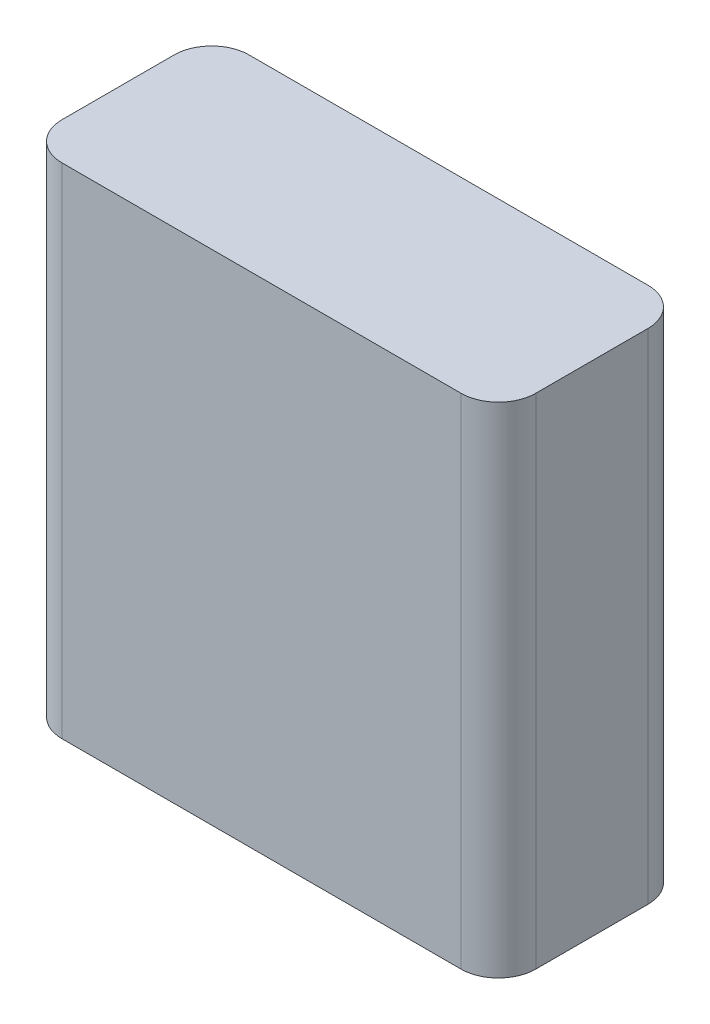
ISO-10303-21;
HEADER;
FILE_DESCRIPTION(('STEP AP214'),'2;1');
FILE_NAME('part.step','',(''),(''),'','','');
FILE_SCHEMA(('AUTOMOTIVE_DESIGN { 1 0 10303 214 1 1 1 1 }'));
ENDSEC;
DATA;
#1=APPLICATION_CONTEXT('core data for automotive mechanical design processes');
#2=APPLICATION_PROTOCOL_DEFINITION('international standard','automotive_design',2000,#1);
#3=PRODUCT_CONTEXT('',#1,'mechanical');
#4=PRODUCT('Part','Part','',(#3));
#5=PRODUCT_RELATED_PRODUCT_CATEGORY('part','',(#4));
#6=PRODUCT_DEFINITION_FORMATION('','',#4);
#7=PRODUCT_DEFINITION_CONTEXT('part definition',#1,'design');
#8=PRODUCT_DEFINITION('design','',#6,#7);
#9=PRODUCT_DEFINITION_SHAPE('','',#8);
#10=(LENGTH_UNIT() NAMED_UNIT(*) SI_UNIT(.MILLI.,.METRE.));
#11=(NAMED_UNIT(*) PLANE_ANGLE_UNIT() SI_UNIT($,.RADIAN.));
#12=(NAMED_UNIT(*) SI_UNIT($,.STERADIAN.) SOLID_ANGLE_UNIT());
#13=UNCERTAINTY_MEASURE_WITH_UNIT(LENGTH_MEASURE(1.E-05),#10,'distance_accuracy_value','');
#14=(GEOMETRIC_REPRESENTATION_CONTEXT(3) GLOBAL_UNCERTAINTY_ASSIGNED_CONTEXT((#13)) GLOBAL_UNIT_ASSIGNED_CONTEXT((#10,
#11,#12)) REPRESENTATION_CONTEXT('',''));
#15=CARTESIAN_POINT('',(0.,0.,0.));
#16=DIRECTION('',(0.,0.,1.));
#17=DIRECTION('',(1.,0.,0.));
#18=AXIS2_PLACEMENT_3D('',#15,#16,#17);
#19=CARTESIAN_POINT('',(406.4,1016.,-114.3));
#20=DIRECTION('',(0.,-1.,0.));
#21=DIRECTION('',(0.,0.,-1.));
#22=AXIS2_PLACEMENT_3D('',#19,#20,#21);
#23=CYLINDRICAL_SURFACE('',#22,76.2);
#24=CARTESIAN_POINT('',(406.4,0.,-114.3));
#25=DIRECTION('',(0.,1.,0.));
#26=DIRECTION('',(0.,0.,-1.));
#27=AXIS2_PLACEMENT_3D('',#24,#25,#26);
#28=CIRCLE('',#27,76.2);
#29=CARTESIAN_POINT('',(482.6,0.,-114.3));
#30=VERTEX_POINT('',#29);
#31=CARTESIAN_POINT('',(406.4,0.,-190.5));
#32=VERTEX_POINT('',#31);
#33=EDGE_CURVE('E128',#30,#32,#28,.T.);
#34=ORIENTED_EDGE('',*,*,#33,.T.);
#35=DIRECTION('',(0.,-1.,0.));
#36=VECTOR('',#35,1.);
#37=CARTESIAN_POINT('',(406.4,1016.,-190.5));
#38=LINE('',#37,#36);
#39=CARTESIAN_POINT('',(406.4,1016.,-190.5));
#40=VERTEX_POINT('',#39);
#41=EDGE_CURVE('E11',#40,#32,#38,.T.);
#42=ORIENTED_EDGE('',*,*,#41,.F.);
#43=CARTESIAN_POINT('',(406.4,1016.,-114.3));
#44=DIRECTION('',(0.,1.,0.));
#45=DIRECTION('',(0.,0.,-1.));
#46=AXIS2_PLACEMENT_3D('',#43,#44,#45);
#47=CIRCLE('',#46,76.2);
#48=CARTESIAN_POINT('',(482.6,1016.,-114.3));
#49=VERTEX_POINT('',#48);
#50=EDGE_CURVE('E142',#49,#40,#47,.T.);
#51=ORIENTED_EDGE('',*,*,#50,.F.);
#52=DIRECTION('',(0.,-1.,0.));
#53=VECTOR('',#52,1.);
#54=CARTESIAN_POINT('',(482.6,1016.,-114.3));
#55=LINE('',#54,#53);
#56=EDGE_CURVE('E124',#49,#30,#55,.T.);
#57=ORIENTED_EDGE('',*,*,#56,.T.);
#58=EDGE_LOOP('',(#34,#42,#51,#57));
#59=FACE_BOUND('',#58,.T.);
#60=ADVANCED_FACE('F32',(#59),#23,.T.);
#61=CARTESIAN_POINT('',(-406.4,1016.,-190.5));
#62=DIRECTION('',(0.,0.,1.));
#63=DIRECTION('',(1.,0.,0.));
#64=AXIS2_PLACEMENT_3D('',#61,#62,#63);
#65=PLANE('',#64);
#66=DIRECTION('',(-1.,0.,0.));
#67=VECTOR('',#66,1.);
#68=CARTESIAN_POINT('',(-406.4,0.,-190.5));
#69=LINE('',#68,#67);
#70=CARTESIAN_POINT('',(-406.4,0.,-190.5));
#71=VERTEX_POINT('',#70);
#72=EDGE_CURVE('E131',#32,#71,#69,.T.);
#73=ORIENTED_EDGE('',*,*,#72,.T.);
#74=DIRECTION('',(0.,-1.,0.));
#75=VECTOR('',#74,1.);
#76=CARTESIAN_POINT('',(-406.4,1016.,-190.5));
#77=LINE('',#76,#75);
#78=CARTESIAN_POINT('',(-406.4,1016.,-190.5));
#79=VERTEX_POINT('',#78);
#80=EDGE_CURVE('E40',#79,#71,#77,.T.);
#81=ORIENTED_EDGE('',*,*,#80,.F.);
#82=DIRECTION('',(-1.,0.,0.));
#83=VECTOR('',#82,1.);
#84=CARTESIAN_POINT('',(-406.4,1016.,-190.5));
#85=LINE('',#84,#83);
#86=EDGE_CURVE('E91',#40,#79,#85,.T.);
#87=ORIENTED_EDGE('',*,*,#86,.F.);
#88=ORIENTED_EDGE('',*,*,#41,.T.);
#89=EDGE_LOOP('',(#73,#81,#87,#88));
#90=FACE_BOUND('',#89,.T.);
#91=ADVANCED_FACE('F177',(#90),#65,.F.);
#92=CARTESIAN_POINT('',(-406.4,1016.,-114.3));
#93=DIRECTION('',(0.,-1.,0.));
#94=DIRECTION('',(0.,0.,-1.));
#95=AXIS2_PLACEMENT_3D('',#92,#93,#94);
#96=CYLINDRICAL_SURFACE('',#95,76.2);
#97=CARTESIAN_POINT('',(-406.4,0.,-114.3));
#98=DIRECTION('',(0.,1.,0.));
#99=DIRECTION('',(0.,0.,1.));
#100=AXIS2_PLACEMENT_3D('',#97,#98,#99);
#101=CIRCLE('',#100,76.2);
#102=CARTESIAN_POINT('',(-482.6,0.,-114.3));
#103=VERTEX_POINT('',#102);
#104=EDGE_CURVE('E133',#71,#103,#101,.T.);
#105=ORIENTED_EDGE('',*,*,#104,.T.);
#106=DIRECTION('',(0.,-1.,0.));
#107=VECTOR('',#106,1.);
#108=CARTESIAN_POINT('',(-482.6,1016.,-114.3));
#109=LINE('',#108,#107);
#110=CARTESIAN_POINT('',(-482.6,1016.,-114.3));
#111=VERTEX_POINT('',#110);
#112=EDGE_CURVE('E149',#111,#103,#109,.T.);
#113=ORIENTED_EDGE('',*,*,#112,.F.);
#114=CARTESIAN_POINT('',(-406.4,1016.,-114.3));
#115=DIRECTION('',(0.,1.,0.));
#116=DIRECTION('',(0.,0.,1.));
#117=AXIS2_PLACEMENT_3D('',#114,#115,#116);
#118=CIRCLE('',#117,76.2);
#119=EDGE_CURVE('E157',#79,#111,#118,.T.);
#120=ORIENTED_EDGE('',*,*,#119,.F.);
#121=ORIENTED_EDGE('',*,*,#80,.T.);
#122=EDGE_LOOP('',(#105,#113,#120,#121));
#123=FACE_BOUND('',#122,.T.);
#124=ADVANCED_FACE('F155',(#123),#96,.T.);
#125=CARTESIAN_POINT('',(-482.6,1016.,114.3));
#126=DIRECTION('',(1.,0.,0.));
#127=DIRECTION('',(0.,0.,-1.));
#128=AXIS2_PLACEMENT_3D('',#125,#126,#127);
#129=PLANE('',#128);
#130=DIRECTION('',(0.,0.,1.));
#131=VECTOR('',#130,1.);
#132=CARTESIAN_POINT('',(-482.6,0.,114.3));
#133=LINE('',#132,#131);
#134=CARTESIAN_POINT('',(-482.6,0.,114.3));
#135=VERTEX_POINT('',#134);
#136=EDGE_CURVE('E135',#103,#135,#133,.T.);
#137=ORIENTED_EDGE('',*,*,#136,.T.);
#138=DIRECTION('',(0.,-1.,0.));
#139=VECTOR('',#138,1.);
#140=CARTESIAN_POINT('',(-482.6,1016.,114.3));
#141=LINE('',#140,#139);
#142=CARTESIAN_POINT('',(-482.6,1016.,114.3));
#143=VERTEX_POINT('',#142);
#144=EDGE_CURVE('E146',#143,#135,#141,.T.);
#145=ORIENTED_EDGE('',*,*,#144,.F.);
#146=DIRECTION('',(0.,0.,1.));
#147=VECTOR('',#146,1.);
#148=CARTESIAN_POINT('',(-482.6,1016.,114.3));
#149=LINE('',#148,#147);
#150=EDGE_CURVE('E169',#111,#143,#149,.T.);
#151=ORIENTED_EDGE('',*,*,#150,.F.);
#152=ORIENTED_EDGE('',*,*,#112,.T.);
#153=EDGE_LOOP('',(#137,#145,#151,#152));
#154=FACE_BOUND('',#153,.T.);
#155=ADVANCED_FACE('F165',(#154),#129,.F.);
#156=CARTESIAN_POINT('',(-406.4,1016.,114.3));
#157=DIRECTION('',(0.,-1.,0.));
#158=DIRECTION('',(0.,0.,-1.));
#159=AXIS2_PLACEMENT_3D('',#156,#157,#158);
#160=CYLINDRICAL_SURFACE('',#159,76.2);
#161=CARTESIAN_POINT('',(-406.4,0.,114.3));
#162=DIRECTION('',(0.,1.,0.));
#163=DIRECTION('',(0.,0.,-1.));
#164=AXIS2_PLACEMENT_3D('',#161,#162,#163);
#165=CIRCLE('',#164,76.2);
#166=CARTESIAN_POINT('',(-406.4,0.,190.5));
#167=VERTEX_POINT('',#166);
#168=EDGE_CURVE('E137',#135,#167,#165,.T.);
#169=ORIENTED_EDGE('',*,*,#168,.T.);
#170=DIRECTION('',(0.,-1.,0.));
#171=VECTOR('',#170,1.);
#172=CARTESIAN_POINT('',(-406.4,1016.,190.5));
#173=LINE('',#172,#171);
#174=CARTESIAN_POINT('',(-406.4,1016.,190.5));
#175=VERTEX_POINT('',#174);
#176=EDGE_CURVE('E119',#175,#167,#173,.T.);
#177=ORIENTED_EDGE('',*,*,#176,.F.);
#178=CARTESIAN_POINT('',(-406.4,1016.,114.3));
#179=DIRECTION('',(0.,1.,0.));
#180=DIRECTION('',(0.,0.,-1.));
#181=AXIS2_PLACEMENT_3D('',#178,#179,#180);
#182=CIRCLE('',#181,76.2);
#183=EDGE_CURVE('E110',#143,#175,#182,.T.);
#184=ORIENTED_EDGE('',*,*,#183,.F.);
#185=ORIENTED_EDGE('',*,*,#144,.T.);
#186=EDGE_LOOP('',(#169,#177,#184,#185));
#187=FACE_BOUND('',#186,.T.);
#188=ADVANCED_FACE('F168',(#187),#160,.T.);
#189=CARTESIAN_POINT('',(-406.4,1016.,190.5));
#190=DIRECTION('',(0.,0.,-1.));
#191=DIRECTION('',(-1.,0.,0.));
#192=AXIS2_PLACEMENT_3D('',#189,#190,#191);
#193=PLANE('',#192);
#194=DIRECTION('',(1.,0.,0.));
#195=VECTOR('',#194,1.);
#196=CARTESIAN_POINT('',(-406.4,0.,190.5));
#197=LINE('',#196,#195);
#198=CARTESIAN_POINT('',(406.4,0.,190.5));
#199=VERTEX_POINT('',#198);
#200=EDGE_CURVE('E118',#167,#199,#197,.T.);
#201=ORIENTED_EDGE('',*,*,#200,.T.);
#202=DIRECTION('',(0.,-1.,0.));
#203=VECTOR('',#202,1.);
#204=CARTESIAN_POINT('',(406.4,1016.,190.5));
#205=LINE('',#204,#203);
#206=CARTESIAN_POINT('',(406.4,1016.,190.5));
#207=VERTEX_POINT('',#206);
#208=EDGE_CURVE('E115',#207,#199,#205,.T.);
#209=ORIENTED_EDGE('',*,*,#208,.F.);
#210=DIRECTION('',(1.,0.,0.));
#211=VECTOR('',#210,1.);
#212=CARTESIAN_POINT('',(-406.4,1016.,190.5));
#213=LINE('',#212,#211);
#214=EDGE_CURVE('E104',#175,#207,#213,.T.);
#215=ORIENTED_EDGE('',*,*,#214,.F.);
#216=ORIENTED_EDGE('',*,*,#176,.T.);
#217=EDGE_LOOP('',(#201,#209,#215,#216));
#218=FACE_BOUND('',#217,.T.);
#219=ADVANCED_FACE('F116',(#218),#193,.F.);
#220=CARTESIAN_POINT('',(406.4,1016.,114.3));
#221=DIRECTION('',(0.,-1.,0.));
#222=DIRECTION('',(0.,0.,-1.));
#223=AXIS2_PLACEMENT_3D('',#220,#221,#222);
#224=CYLINDRICAL_SURFACE('',#223,76.2);
#225=CARTESIAN_POINT('',(406.4,0.,114.3));
#226=DIRECTION('',(0.,1.,0.));
#227=DIRECTION('',(0.,0.,-1.));
#228=AXIS2_PLACEMENT_3D('',#225,#226,#227);
#229=CIRCLE('',#228,76.2);
#230=CARTESIAN_POINT('',(482.6,0.,114.3));
#231=VERTEX_POINT('',#230);
#232=EDGE_CURVE('E77',#199,#231,#229,.T.);
#233=ORIENTED_EDGE('',*,*,#232,.T.);
#234=DIRECTION('',(0.,-1.,0.));
#235=VECTOR('',#234,1.);
#236=CARTESIAN_POINT('',(482.6,1016.,114.3));
#237=LINE('',#236,#235);
#238=CARTESIAN_POINT('',(482.6,1016.,114.3));
#239=VERTEX_POINT('',#238);
#240=EDGE_CURVE('E120',#239,#231,#237,.T.);
#241=ORIENTED_EDGE('',*,*,#240,.F.);
#242=CARTESIAN_POINT('',(406.4,1016.,114.3));
#243=DIRECTION('',(0.,1.,0.));
#244=DIRECTION('',(0.,0.,-1.));
#245=AXIS2_PLACEMENT_3D('',#242,#243,#244);
#246=CIRCLE('',#245,76.2);
#247=EDGE_CURVE('E108',#207,#239,#246,.T.);
#248=ORIENTED_EDGE('',*,*,#247,.F.);
#249=ORIENTED_EDGE('',*,*,#208,.T.);
#250=EDGE_LOOP('',(#233,#241,#248,#249));
#251=FACE_BOUND('',#250,.T.);
#252=ADVANCED_FACE('F122',(#251),#224,.T.);
#253=CARTESIAN_POINT('',(482.6,1016.,114.3));
#254=DIRECTION('',(-1.,0.,0.));
#255=DIRECTION('',(0.,0.,1.));
#256=AXIS2_PLACEMENT_3D('',#253,#254,#255);
#257=PLANE('',#256);
#258=DIRECTION('',(0.,0.,-1.));
#259=VECTOR('',#258,1.);
#260=CARTESIAN_POINT('',(482.6,0.,114.3));
#261=LINE('',#260,#259);
#262=EDGE_CURVE('E83',#231,#30,#261,.T.);
#263=ORIENTED_EDGE('',*,*,#262,.T.);
#264=ORIENTED_EDGE('',*,*,#56,.F.);
#265=DIRECTION('',(0.,0.,-1.));
#266=VECTOR('',#265,1.);
#267=CARTESIAN_POINT('',(482.6,1016.,114.3));
#268=LINE('',#267,#266);
#269=EDGE_CURVE('E48',#239,#49,#268,.T.);
#270=ORIENTED_EDGE('',*,*,#269,.F.);
#271=ORIENTED_EDGE('',*,*,#240,.T.);
#272=EDGE_LOOP('',(#263,#264,#270,#271));
#273=FACE_BOUND('',#272,.T.);
#274=ADVANCED_FACE('F193',(#273),#257,.F.);
#275=CARTESIAN_POINT('',(406.4,1016.,-114.3));
#276=DIRECTION('',(0.,-1.,0.));
#277=DIRECTION('',(0.,0.,-1.));
#278=AXIS2_PLACEMENT_3D('',#275,#276,#277);
#279=PLANE('',#278);
#280=ORIENTED_EDGE('',*,*,#50,.T.);
#281=ORIENTED_EDGE('',*,*,#86,.T.);
#282=ORIENTED_EDGE('',*,*,#119,.T.);
#283=ORIENTED_EDGE('',*,*,#150,.T.);
#284=ORIENTED_EDGE('',*,*,#183,.T.);
#285=ORIENTED_EDGE('',*,*,#214,.T.);
#286=ORIENTED_EDGE('',*,*,#247,.T.);
#287=ORIENTED_EDGE('',*,*,#269,.T.);
#288=EDGE_LOOP('',(#280,#281,#282,#283,#284,#285,#286,#287));
#289=FACE_BOUND('',#288,.T.);
#290=ADVANCED_FACE('F106',(#289),#279,.F.);
#291=CARTESIAN_POINT('',(406.4,0.,-114.3));
#292=DIRECTION('',(0.,-1.,0.));
#293=DIRECTION('',(0.,0.,-1.));
#294=AXIS2_PLACEMENT_3D('',#291,#292,#293);
#295=PLANE('',#294);
#296=ORIENTED_EDGE('',*,*,#33,.F.);
#297=ORIENTED_EDGE('',*,*,#262,.F.);
#298=ORIENTED_EDGE('',*,*,#232,.F.);
#299=ORIENTED_EDGE('',*,*,#200,.F.);
#300=ORIENTED_EDGE('',*,*,#168,.F.);
#301=ORIENTED_EDGE('',*,*,#136,.F.);
#302=ORIENTED_EDGE('',*,*,#104,.F.);
#303=ORIENTED_EDGE('',*,*,#72,.F.);
#304=EDGE_LOOP('',(#296,#297,#298,#299,#300,#301,#302,#303));
#305=FACE_BOUND('',#304,.T.);
#306=ADVANCED_FACE('F161',(#305),#295,.T.);
#307=CLOSED_SHELL('',(#60,#91,#124,#155,#188,#219,#252,#274,#290,#306));
#308=MANIFOLD_SOLID_BREP('B2',#307);
#309=ADVANCED_BREP_SHAPE_REPRESENTATION('',(#18,#308),#14);
#310=SHAPE_DEFINITION_REPRESENTATION(#9,#309);
ENDSEC;
END-ISO-10303-21;
